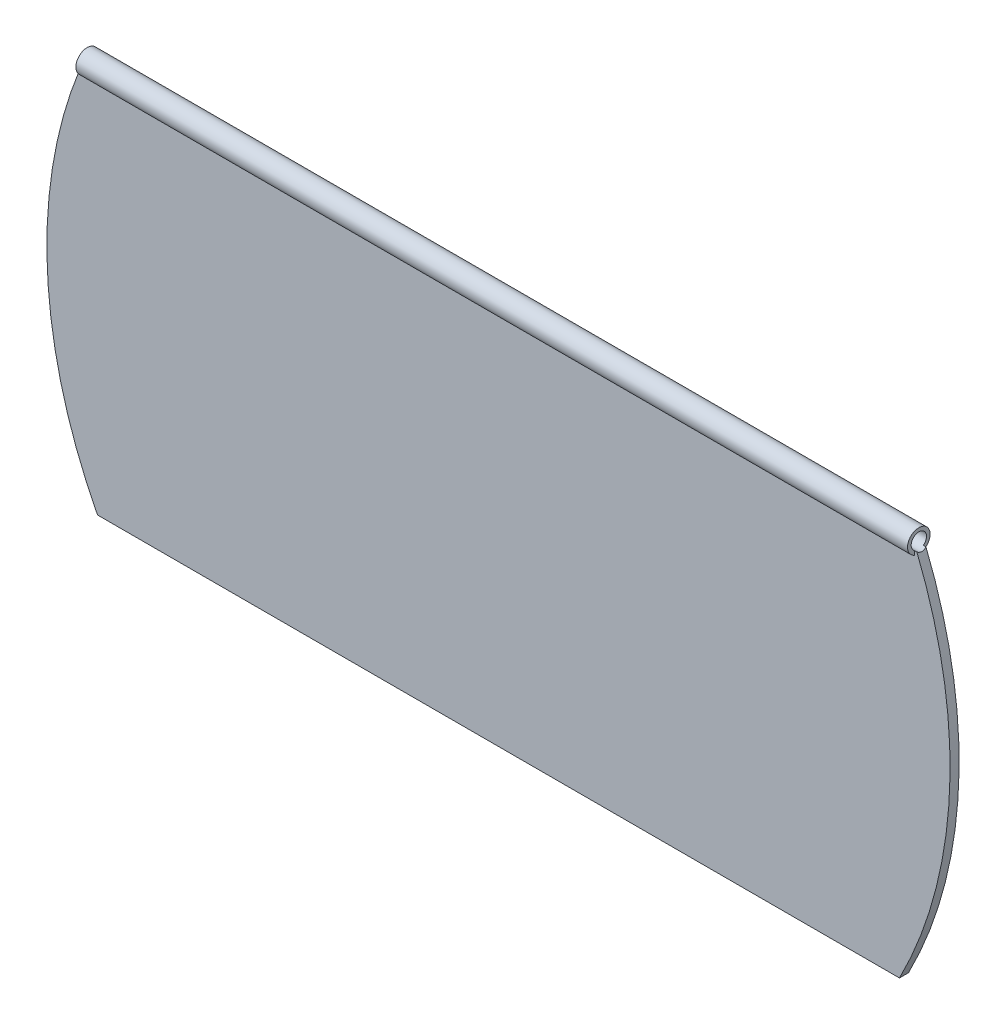
ISO-10303-21;
HEADER;
FILE_DESCRIPTION(('STEP AP214'),'2;1');
FILE_NAME('part.step','',(''),(''),'','','');
FILE_SCHEMA(('AUTOMOTIVE_DESIGN { 1 0 10303 214 1 1 1 1 }'));
ENDSEC;
DATA;
#1=APPLICATION_CONTEXT('core data for automotive mechanical design processes');
#2=APPLICATION_PROTOCOL_DEFINITION('international standard','automotive_design',2000,#1);
#3=PRODUCT_CONTEXT('',#1,'mechanical');
#4=PRODUCT('Part','Part','',(#3));
#5=PRODUCT_RELATED_PRODUCT_CATEGORY('part','',(#4));
#6=PRODUCT_DEFINITION_FORMATION('','',#4);
#7=PRODUCT_DEFINITION_CONTEXT('part definition',#1,'design');
#8=PRODUCT_DEFINITION('design','',#6,#7);
#9=PRODUCT_DEFINITION_SHAPE('','',#8);
#10=(LENGTH_UNIT() NAMED_UNIT(*) SI_UNIT(.MILLI.,.METRE.));
#11=(NAMED_UNIT(*) PLANE_ANGLE_UNIT() SI_UNIT($,.RADIAN.));
#12=(NAMED_UNIT(*) SI_UNIT($,.STERADIAN.) SOLID_ANGLE_UNIT());
#13=UNCERTAINTY_MEASURE_WITH_UNIT(LENGTH_MEASURE(1.E-05),#10,'distance_accuracy_value','');
#14=(GEOMETRIC_REPRESENTATION_CONTEXT(3) GLOBAL_UNCERTAINTY_ASSIGNED_CONTEXT((#13)) GLOBAL_UNIT_ASSIGNED_CONTEXT((#10,
#11,#12)) REPRESENTATION_CONTEXT('',''));
#15=CARTESIAN_POINT('',(0.,0.,0.));
#16=DIRECTION('',(0.,0.,1.));
#17=DIRECTION('',(1.,0.,0.));
#18=AXIS2_PLACEMENT_3D('',#15,#16,#17);
#19=CARTESIAN_POINT('',(0.,0.,4.));
#20=DIRECTION('',(0.,0.,1.));
#21=DIRECTION('',(1.,0.,0.));
#22=AXIS2_PLACEMENT_3D('',#19,#20,#21);
#23=PLANE('',#22);
#24=CARTESIAN_POINT('',(0.,0.,4.));
#25=DIRECTION('',(0.,0.,1.));
#26=DIRECTION('',(1.,0.,0.));
#27=AXIS2_PLACEMENT_3D('',#24,#25,#26);
#28=CIRCLE('',#27,200.);
#29=CARTESIAN_POINT('',(177.583783043385,-92.0000000000002,4.));
#30=VERTEX_POINT('',#29);
#31=CARTESIAN_POINT('',(185.303451357626,75.2504545830264,4.));
#32=VERTEX_POINT('',#31);
#33=EDGE_CURVE('E106',#30,#32,#28,.T.);
#34=ORIENTED_EDGE('',*,*,#33,.T.);
#35=DIRECTION('',(-1.,0.,0.));
#36=VECTOR('',#35,1.);
#37=CARTESIAN_POINT('',(194.162971305309,75.2504545830264,4.));
#38=LINE('',#37,#36);
#39=CARTESIAN_POINT('',(184.162971305309,75.2504545830264,4.));
#40=VERTEX_POINT('',#39);
#41=EDGE_CURVE('E104',#32,#40,#38,.T.);
#42=ORIENTED_EDGE('',*,*,#41,.T.);
#43=DIRECTION('',(0.,1.,0.));
#44=VECTOR('',#43,1.);
#45=CARTESIAN_POINT('',(184.162971305309,0.,4.));
#46=LINE('',#45,#44);
#47=CARTESIAN_POINT('',(184.162971305309,73.417424305044,4.));
#48=VERTEX_POINT('',#47);
#49=EDGE_CURVE('E63',#48,#40,#46,.T.);
#50=ORIENTED_EDGE('',*,*,#49,.F.);
#51=DIRECTION('',(-1.,0.,0.));
#52=VECTOR('',#51,1.);
#53=CARTESIAN_POINT('',(184.162971305309,73.417424305044,4.));
#54=LINE('',#53,#52);
#55=CARTESIAN_POINT('',(-184.162971305309,73.417424305044,4.));
#56=VERTEX_POINT('',#55);
#57=EDGE_CURVE('E122',#48,#56,#54,.T.);
#58=ORIENTED_EDGE('',*,*,#57,.T.);
#59=DIRECTION('',(0.,-1.,0.));
#60=VECTOR('',#59,1.);
#61=CARTESIAN_POINT('',(-184.162971305309,0.,4.));
#62=LINE('',#61,#60);
#63=CARTESIAN_POINT('',(-184.162971305309,75.2504545830264,4.));
#64=VERTEX_POINT('',#63);
#65=EDGE_CURVE('E126',#64,#56,#62,.T.);
#66=ORIENTED_EDGE('',*,*,#65,.F.);
#67=DIRECTION('',(1.,0.,0.));
#68=VECTOR('',#67,1.);
#69=CARTESIAN_POINT('',(-200.001,75.2504545830264,4.));
#70=LINE('',#69,#68);
#71=CARTESIAN_POINT('',(-185.303451357626,75.2504545830264,4.));
#72=VERTEX_POINT('',#71);
#73=EDGE_CURVE('E55',#64,#72,#70,.F.);
#74=ORIENTED_EDGE('',*,*,#73,.T.);
#75=CARTESIAN_POINT('',(0.,0.,4.));
#76=DIRECTION('',(0.,0.,1.));
#77=DIRECTION('',(1.,0.,0.));
#78=AXIS2_PLACEMENT_3D('',#75,#76,#77);
#79=CIRCLE('',#78,200.);
#80=CARTESIAN_POINT('',(-177.583783043385,-92.0000000000002,4.));
#81=VERTEX_POINT('',#80);
#82=EDGE_CURVE('E134',#72,#81,#79,.T.);
#83=ORIENTED_EDGE('',*,*,#82,.T.);
#84=DIRECTION('',(1.,0.,0.));
#85=VECTOR('',#84,1.);
#86=CARTESIAN_POINT('',(177.583783043385,-92.0000000000002,4.));
#87=LINE('',#86,#85);
#88=EDGE_CURVE('E136',#81,#30,#87,.T.);
#89=ORIENTED_EDGE('',*,*,#88,.T.);
#90=EDGE_LOOP('',(#34,#42,#50,#58,#66,#74,#83,#89));
#91=FACE_BOUND('',#90,.T.);
#92=ADVANCED_FACE('F40',(#91),#23,.T.);
#93=CARTESIAN_POINT('',(0.,0.,0.));
#94=DIRECTION('',(0.,0.,1.));
#95=DIRECTION('',(1.,0.,0.));
#96=AXIS2_PLACEMENT_3D('',#93,#94,#95);
#97=PLANE('',#96);
#98=DIRECTION('',(-1.,0.,0.));
#99=VECTOR('',#98,1.);
#100=CARTESIAN_POINT('',(194.162971305309,75.2504545830264,0.));
#101=LINE('',#100,#99);
#102=CARTESIAN_POINT('',(185.303451357626,75.2504545830264,0.));
#103=VERTEX_POINT('',#102);
#104=CARTESIAN_POINT('',(184.162971305309,75.2504545830264,0.));
#105=VERTEX_POINT('',#104);
#106=EDGE_CURVE('E111',#103,#105,#101,.T.);
#107=ORIENTED_EDGE('',*,*,#106,.F.);
#108=CARTESIAN_POINT('',(0.,0.,0.));
#109=DIRECTION('',(0.,0.,1.));
#110=DIRECTION('',(1.,0.,0.));
#111=AXIS2_PLACEMENT_3D('',#108,#109,#110);
#112=CIRCLE('',#111,200.);
#113=CARTESIAN_POINT('',(177.583783043385,-92.0000000000002,0.));
#114=VERTEX_POINT('',#113);
#115=EDGE_CURVE('E137',#114,#103,#112,.T.);
#116=ORIENTED_EDGE('',*,*,#115,.F.);
#117=DIRECTION('',(1.,0.,0.));
#118=VECTOR('',#117,1.);
#119=CARTESIAN_POINT('',(177.583783043385,-92.0000000000002,0.));
#120=LINE('',#119,#118);
#121=CARTESIAN_POINT('',(-177.583783043385,-92.0000000000002,0.));
#122=VERTEX_POINT('',#121);
#123=EDGE_CURVE('E142',#122,#114,#120,.T.);
#124=ORIENTED_EDGE('',*,*,#123,.F.);
#125=CARTESIAN_POINT('',(0.,0.,0.));
#126=DIRECTION('',(0.,0.,1.));
#127=DIRECTION('',(1.,0.,0.));
#128=AXIS2_PLACEMENT_3D('',#125,#126,#127);
#129=CIRCLE('',#128,200.);
#130=CARTESIAN_POINT('',(-185.303451357626,75.2504545830264,0.));
#131=VERTEX_POINT('',#130);
#132=EDGE_CURVE('E121',#131,#122,#129,.T.);
#133=ORIENTED_EDGE('',*,*,#132,.F.);
#134=DIRECTION('',(1.,0.,0.));
#135=VECTOR('',#134,1.);
#136=CARTESIAN_POINT('',(-200.001,75.2504545830264,0.));
#137=LINE('',#136,#135);
#138=CARTESIAN_POINT('',(-184.162971305309,75.2504545830264,0.));
#139=VERTEX_POINT('',#138);
#140=EDGE_CURVE('E110',#139,#131,#137,.F.);
#141=ORIENTED_EDGE('',*,*,#140,.F.);
#142=DIRECTION('',(0.,-1.,0.));
#143=VECTOR('',#142,1.);
#144=CARTESIAN_POINT('',(-184.162971305309,0.,0.));
#145=LINE('',#144,#143);
#146=CARTESIAN_POINT('',(-184.162971305309,73.417424305044,0.));
#147=VERTEX_POINT('',#146);
#148=EDGE_CURVE('E129',#139,#147,#145,.T.);
#149=ORIENTED_EDGE('',*,*,#148,.T.);
#150=DIRECTION('',(-1.,0.,0.));
#151=VECTOR('',#150,1.);
#152=CARTESIAN_POINT('',(184.162971305309,73.417424305044,0.));
#153=LINE('',#152,#151);
#154=CARTESIAN_POINT('',(184.162971305309,73.417424305044,0.));
#155=VERTEX_POINT('',#154);
#156=EDGE_CURVE('E11',#155,#147,#153,.T.);
#157=ORIENTED_EDGE('',*,*,#156,.F.);
#158=DIRECTION('',(0.,1.,0.));
#159=VECTOR('',#158,1.);
#160=CARTESIAN_POINT('',(184.162971305309,0.,0.));
#161=LINE('',#160,#159);
#162=EDGE_CURVE('E48',#155,#105,#161,.T.);
#163=ORIENTED_EDGE('',*,*,#162,.T.);
#164=EDGE_LOOP('',(#107,#116,#124,#133,#141,#149,#157,#163));
#165=FACE_BOUND('',#164,.T.);
#166=ADVANCED_FACE('F152',(#165),#97,.F.);
#167=CARTESIAN_POINT('',(0.,0.,4.));
#168=DIRECTION('',(0.,0.,-1.));
#169=DIRECTION('',(-1.,0.,0.));
#170=AXIS2_PLACEMENT_3D('',#167,#168,#169);
#171=CYLINDRICAL_SURFACE('',#170,200.);
#172=CARTESIAN_POINT('',(185.303451357626,75.2504545830264,4.));
#173=CARTESIAN_POINT('',(185.324754362732,75.1979959687894,3.92789671204913));
#174=CARTESIAN_POINT('',(185.344939042211,75.1482276677896,3.85349777527535));
#175=CARTESIAN_POINT('',(185.382927694263,75.0544648015726,3.70054575132217));
#176=CARTESIAN_POINT('',(185.400731120392,75.0104715616456,3.62199171639218));
#177=CARTESIAN_POINT('',(185.433822719904,74.9286283358651,3.46110574489207));
#178=CARTESIAN_POINT('',(185.449107916927,74.8907856201767,3.3787694828591));
#179=CARTESIAN_POINT('',(185.477003503623,74.8216716652278,3.21098081585479));
#180=CARTESIAN_POINT('',(185.489614137465,74.7903998260953,3.12552869617458));
#181=CARTESIAN_POINT('',(185.523295906974,74.7068294747958,2.86500612217313));
#182=CARTESIAN_POINT('',(185.540185970422,74.664852768812,2.68591958839445));
#183=CARTESIAN_POINT('',(185.562090981906,74.6103964920772,2.32290520369737));
#184=CARTESIAN_POINT('',(185.56712070926,74.5978802103474,2.13898366718178));
#185=CARTESIAN_POINT('',(185.565207190722,74.6026398567698,1.77676327186621));
#186=CARTESIAN_POINT('',(185.558595255485,74.6190913891617,1.59845117685918));
#187=CARTESIAN_POINT('',(185.534242641072,74.6796214737865,1.24710061693324));
#188=CARTESIAN_POINT('',(185.516490673385,74.7237280496213,1.07406768827186));
#189=CARTESIAN_POINT('',(185.482338685348,74.8084413377776,0.824657988961216));
#190=CARTESIAN_POINT('',(185.469918853924,74.8392311176035,0.74424296381427));
#191=CARTESIAN_POINT('',(185.442698342085,74.9066549855218,0.586289043551726));
#192=CARTESIAN_POINT('',(185.427897539522,74.9432893734526,0.508750296245797));
#193=CARTESIAN_POINT('',(185.396051668974,75.0220355967664,0.357131439564282));
#194=CARTESIAN_POINT('',(185.37900958531,75.064140147602,0.283046905444786));
#195=CARTESIAN_POINT('',(185.342796055038,75.1535113543893,0.138623058940927));
#196=CARTESIAN_POINT('',(185.32362498327,75.2007771016084,0.0682830904840463));
#197=CARTESIAN_POINT('',(185.303451357626,75.2504545830264,0.));
#198=B_SPLINE_CURVE_WITH_KNOTS('',3,(#172,#173,#174,#175,#176,#177,#178,#179,#180,#181,#182,
#183,#184,#185,#186,#187,#188,#189,#190,#191,#192,#193,#194,#195,#196,#197),.UNSPECIFIED.,.F.,
.F.,(4,2,2,2,2,2,2,2,2,2,2,2,4),(0.,0.274963446505939,0.549989883113388,0.825339084077239,
1.10066313677978,1.65181878361911,2.20228726452791,2.73734212372455,3.2729400466484,
3.53371365658415,3.7945006489588,4.05494384766287,4.31534126380231),.UNSPECIFIED.);
#199=EDGE_CURVE('E183',#32,#103,#198,.T.);
#200=ORIENTED_EDGE('',*,*,#199,.F.);
#201=ORIENTED_EDGE('',*,*,#33,.F.);
#202=DIRECTION('',(0.,0.,-1.));
#203=VECTOR('',#202,1.);
#204=CARTESIAN_POINT('',(177.583783043385,-92.0000000000002,4.));
#205=LINE('',#204,#203);
#206=EDGE_CURVE('E140',#30,#114,#205,.T.);
#207=ORIENTED_EDGE('',*,*,#206,.T.);
#208=ORIENTED_EDGE('',*,*,#115,.T.);
#209=EDGE_LOOP('',(#200,#201,#207,#208));
#210=FACE_BOUND('',#209,.T.);
#211=ADVANCED_FACE('F189',(#210),#171,.T.);
#212=CARTESIAN_POINT('',(0.,0.,4.));
#213=DIRECTION('',(0.,0.,-1.));
#214=DIRECTION('',(-1.,0.,0.));
#215=AXIS2_PLACEMENT_3D('',#212,#213,#214);
#216=CYLINDRICAL_SURFACE('',#215,200.);
#217=ORIENTED_EDGE('',*,*,#82,.F.);
#218=CARTESIAN_POINT('',(-185.303451357626,75.2504545830264,0.));
#219=CARTESIAN_POINT('',(-185.324754362732,75.1979959687894,0.0721032879508691));
#220=CARTESIAN_POINT('',(-185.344939042211,75.1482276677896,0.146502224724654));
#221=CARTESIAN_POINT('',(-185.382927694263,75.0544648015726,0.299454248677832));
#222=CARTESIAN_POINT('',(-185.400731120392,75.0104715616456,0.378008283607823));
#223=CARTESIAN_POINT('',(-185.433822719904,74.9286283358651,0.538894255107933));
#224=CARTESIAN_POINT('',(-185.449107916927,74.8907856201767,0.621230517140896));
#225=CARTESIAN_POINT('',(-185.477003503623,74.8216716652278,0.789019184145214));
#226=CARTESIAN_POINT('',(-185.489614137465,74.7903998260953,0.874471303825417));
#227=CARTESIAN_POINT('',(-185.523295906974,74.7068294747958,1.13499387782687));
#228=CARTESIAN_POINT('',(-185.540185970422,74.664852768812,1.31408041160555));
#229=CARTESIAN_POINT('',(-185.562090981906,74.6103964920772,1.67709479630263));
#230=CARTESIAN_POINT('',(-185.56712070926,74.5978802103474,1.86101633281821));
#231=CARTESIAN_POINT('',(-185.565207190722,74.6026398567698,2.22323672813379));
#232=CARTESIAN_POINT('',(-185.558595255485,74.6190913891617,2.40154882314082));
#233=CARTESIAN_POINT('',(-185.534242641072,74.6796214737865,2.75289938306676));
#234=CARTESIAN_POINT('',(-185.516490673385,74.7237280496213,2.92593231172814));
#235=CARTESIAN_POINT('',(-185.482338685348,74.8084413377776,3.17534201103878));
#236=CARTESIAN_POINT('',(-185.469918853924,74.8392311176035,3.25575703618573));
#237=CARTESIAN_POINT('',(-185.442698342085,74.9066549855218,3.41371095644827));
#238=CARTESIAN_POINT('',(-185.427897539522,74.9432893734526,3.4912497037542));
#239=CARTESIAN_POINT('',(-185.396051668974,75.0220355967664,3.64286856043572));
#240=CARTESIAN_POINT('',(-185.37900958531,75.064140147602,3.71695309455521));
#241=CARTESIAN_POINT('',(-185.342796055038,75.1535113543893,3.86137694105907));
#242=CARTESIAN_POINT('',(-185.32362498327,75.2007771016084,3.93171690951595));
#243=CARTESIAN_POINT('',(-185.303451357626,75.2504545830264,4.));
#244=B_SPLINE_CURVE_WITH_KNOTS('',3,(#218,#219,#220,#221,#222,#223,#224,#225,#226,#227,#228,
#229,#230,#231,#232,#233,#234,#235,#236,#237,#238,#239,#240,#241,#242,#243),.UNSPECIFIED.,.F.,
.F.,(4,2,2,2,2,2,2,2,2,2,2,2,4),(0.,0.27496344650594,0.549989883113388,0.825339084077239,
1.10066313677978,1.65181878361911,2.20228726452791,2.73734212372455,3.2729400466484,
3.53371365658414,3.7945006489588,4.05494384766287,4.31534126380231),.UNSPECIFIED.);
#245=EDGE_CURVE('E166',#131,#72,#244,.T.);
#246=ORIENTED_EDGE('',*,*,#245,.F.);
#247=ORIENTED_EDGE('',*,*,#132,.T.);
#248=DIRECTION('',(0.,0.,-1.));
#249=VECTOR('',#248,1.);
#250=CARTESIAN_POINT('',(-177.583783043385,-92.0000000000002,4.));
#251=LINE('',#250,#249);
#252=EDGE_CURVE('E148',#81,#122,#251,.T.);
#253=ORIENTED_EDGE('',*,*,#252,.F.);
#254=EDGE_LOOP('',(#217,#246,#247,#253));
#255=FACE_BOUND('',#254,.T.);
#256=ADVANCED_FACE('F42',(#255),#216,.T.);
#257=CARTESIAN_POINT('',(177.583783043385,-92.0000000000002,4.));
#258=DIRECTION('',(0.,1.,0.));
#259=DIRECTION('',(0.,0.,1.));
#260=AXIS2_PLACEMENT_3D('',#257,#258,#259);
#261=PLANE('',#260);
#262=ORIENTED_EDGE('',*,*,#123,.T.);
#263=ORIENTED_EDGE('',*,*,#206,.F.);
#264=ORIENTED_EDGE('',*,*,#88,.F.);
#265=ORIENTED_EDGE('',*,*,#252,.T.);
#266=EDGE_LOOP('',(#262,#263,#264,#265));
#267=FACE_BOUND('',#266,.T.);
#268=ADVANCED_FACE('F195',(#267),#261,.F.);
#269=CARTESIAN_POINT('',(184.162971305309,77.9999999999999,2.));
#270=DIRECTION('',(1.,0.,0.));
#271=DIRECTION('',(0.,0.,-1.));
#272=AXIS2_PLACEMENT_3D('',#269,#270,#271);
#273=PLANE('',#272);
#274=CARTESIAN_POINT('',(184.162971305309,77.9999999999999,2.));
#275=DIRECTION('',(1.,0.,0.));
#276=DIRECTION('',(0.,0.,-1.));
#277=AXIS2_PLACEMENT_3D('',#274,#275,#276);
#278=CIRCLE('',#277,5.);
#279=EDGE_CURVE('E120',#155,#48,#278,.T.);
#280=ORIENTED_EDGE('',*,*,#279,.T.);
#281=ORIENTED_EDGE('',*,*,#49,.T.);
#282=CARTESIAN_POINT('',(184.162971305309,77.9999999999999,2.));
#283=DIRECTION('',(1.,0.,0.));
#284=DIRECTION('',(0.,0.,-1.));
#285=AXIS2_PLACEMENT_3D('',#282,#283,#284);
#286=CIRCLE('',#285,3.4);
#287=EDGE_CURVE('E117',#105,#40,#286,.T.);
#288=ORIENTED_EDGE('',*,*,#287,.F.);
#289=ORIENTED_EDGE('',*,*,#162,.F.);
#290=EDGE_LOOP('',(#280,#281,#288,#289));
#291=FACE_BOUND('',#290,.T.);
#292=ADVANCED_FACE('F116',(#291),#273,.T.);
#293=CARTESIAN_POINT('',(184.162971305309,77.9999999999999,2.));
#294=DIRECTION('',(-1.,0.,0.));
#295=DIRECTION('',(0.,0.,1.));
#296=AXIS2_PLACEMENT_3D('',#293,#294,#295);
#297=CYLINDRICAL_SURFACE('',#296,5.);
#298=ORIENTED_EDGE('',*,*,#57,.F.);
#299=ORIENTED_EDGE('',*,*,#279,.F.);
#300=ORIENTED_EDGE('',*,*,#156,.T.);
#301=CARTESIAN_POINT('',(-184.162971305309,77.9999999999999,2.));
#302=DIRECTION('',(-1.,0.,0.));
#303=DIRECTION('',(0.,0.,1.));
#304=AXIS2_PLACEMENT_3D('',#301,#302,#303);
#305=CIRCLE('',#304,5.00000000000001);
#306=EDGE_CURVE('E158',#56,#147,#305,.T.);
#307=ORIENTED_EDGE('',*,*,#306,.F.);
#308=EDGE_LOOP('',(#298,#299,#300,#307));
#309=FACE_BOUND('',#308,.T.);
#310=ADVANCED_FACE('F155',(#309),#297,.T.);
#311=CARTESIAN_POINT('',(184.162971305309,77.9999999999999,2.));
#312=DIRECTION('',(-1.,0.,0.));
#313=DIRECTION('',(0.,0.,1.));
#314=AXIS2_PLACEMENT_3D('',#311,#312,#313);
#315=CYLINDRICAL_SURFACE('',#314,3.4);
#316=ORIENTED_EDGE('',*,*,#287,.T.);
#317=ORIENTED_EDGE('',*,*,#41,.F.);
#318=ORIENTED_EDGE('',*,*,#199,.T.);
#319=ORIENTED_EDGE('',*,*,#106,.T.);
#320=EDGE_LOOP('',(#316,#317,#318,#319));
#321=FACE_BOUND('',#320,.T.);
#322=ORIENTED_EDGE('',*,*,#245,.T.);
#323=ORIENTED_EDGE('',*,*,#73,.F.);
#324=CARTESIAN_POINT('',(-184.162971305309,77.9999999999999,2.));
#325=DIRECTION('',(-1.,0.,0.));
#326=DIRECTION('',(0.,0.,1.));
#327=AXIS2_PLACEMENT_3D('',#324,#325,#326);
#328=CIRCLE('',#327,3.4);
#329=EDGE_CURVE('E164',#139,#64,#328,.F.);
#330=ORIENTED_EDGE('',*,*,#329,.F.);
#331=ORIENTED_EDGE('',*,*,#140,.T.);
#332=EDGE_LOOP('',(#322,#323,#330,#331));
#333=FACE_BOUND('',#332,.T.);
#334=ADVANCED_FACE('F124',(#321,#333),#315,.F.);
#335=CARTESIAN_POINT('',(-184.162971305309,77.9999999999999,2.));
#336=DIRECTION('',(-1.,0.,0.));
#337=DIRECTION('',(0.,0.,1.));
#338=AXIS2_PLACEMENT_3D('',#335,#336,#337);
#339=PLANE('',#338);
#340=ORIENTED_EDGE('',*,*,#329,.T.);
#341=ORIENTED_EDGE('',*,*,#65,.T.);
#342=ORIENTED_EDGE('',*,*,#306,.T.);
#343=ORIENTED_EDGE('',*,*,#148,.F.);
#344=EDGE_LOOP('',(#340,#341,#342,#343));
#345=FACE_BOUND('',#344,.T.);
#346=ADVANCED_FACE('F162',(#345),#339,.T.);
#347=CLOSED_SHELL('',(#92,#166,#211,#256,#268,#292,#310,#334,#346));
#348=MANIFOLD_SOLID_BREP('B2',#347);
#349=ADVANCED_BREP_SHAPE_REPRESENTATION('',(#18,#348),#14);
#350=SHAPE_DEFINITION_REPRESENTATION(#9,#349);
ENDSEC;
END-ISO-10303-21;
